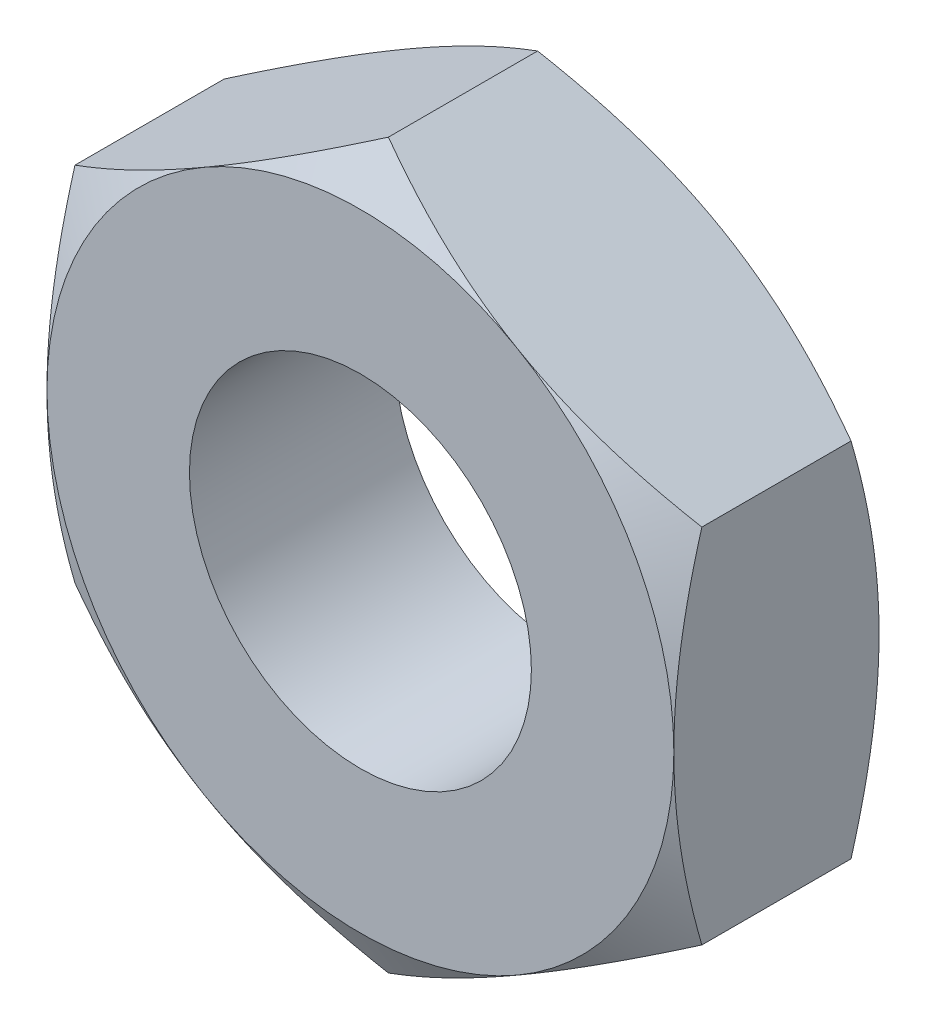
ISO-10303-21;
HEADER;
FILE_DESCRIPTION(('STEP AP214'),'2;1');
FILE_NAME('part.step','',(''),(''),'','','');
FILE_SCHEMA(('AUTOMOTIVE_DESIGN { 1 0 10303 214 1 1 1 1 }'));
ENDSEC;
DATA;
#1=APPLICATION_CONTEXT('core data for automotive mechanical design processes');
#2=APPLICATION_PROTOCOL_DEFINITION('international standard','automotive_design',2000,#1);
#3=PRODUCT_CONTEXT('',#1,'mechanical');
#4=PRODUCT('Part','Part','',(#3));
#5=PRODUCT_RELATED_PRODUCT_CATEGORY('part','',(#4));
#6=PRODUCT_DEFINITION_FORMATION('','',#4);
#7=PRODUCT_DEFINITION_CONTEXT('part definition',#1,'design');
#8=PRODUCT_DEFINITION('design','',#6,#7);
#9=PRODUCT_DEFINITION_SHAPE('','',#8);
#10=(LENGTH_UNIT() NAMED_UNIT(*) SI_UNIT(.MILLI.,.METRE.));
#11=(NAMED_UNIT(*) PLANE_ANGLE_UNIT() SI_UNIT($,.RADIAN.));
#12=(NAMED_UNIT(*) SI_UNIT($,.STERADIAN.) SOLID_ANGLE_UNIT());
#13=UNCERTAINTY_MEASURE_WITH_UNIT(LENGTH_MEASURE(1.E-05),#10,'distance_accuracy_value','');
#14=(GEOMETRIC_REPRESENTATION_CONTEXT(3) GLOBAL_UNCERTAINTY_ASSIGNED_CONTEXT((#13)) GLOBAL_UNIT_ASSIGNED_CONTEXT((#10,
#11,#12)) REPRESENTATION_CONTEXT('',''));
#15=CARTESIAN_POINT('',(0.,0.,0.));
#16=DIRECTION('',(0.,0.,1.));
#17=DIRECTION('',(1.,0.,0.));
#18=AXIS2_PLACEMENT_3D('',#15,#16,#17);
#19=CARTESIAN_POINT('',(0.,0.,-0.9));
#20=DIRECTION('',(0.,0.,1.));
#21=DIRECTION('',(1.,0.,0.));
#22=AXIS2_PLACEMENT_3D('',#19,#20,#21);
#23=PLANE('',#22);
#24=CARTESIAN_POINT('',(0.,0.,-0.9));
#25=DIRECTION('',(0.,0.,1.));
#26=DIRECTION('',(1.,0.,0.));
#27=AXIS2_PLACEMENT_3D('',#24,#25,#26);
#28=CIRCLE('',#27,1.5);
#29=CARTESIAN_POINT('',(1.5,0.,-0.9));
#30=VERTEX_POINT('',#29);
#31=EDGE_CURVE('E250',#30,#30,#28,.T.);
#32=ORIENTED_EDGE('',*,*,#31,.T.);
#33=EDGE_LOOP('',(#32));
#34=FACE_BOUND('',#33,.T.);
#35=CARTESIAN_POINT('',(0.,0.,-0.9));
#36=DIRECTION('',(0.,0.,1.));
#37=DIRECTION('',(1.,0.,0.));
#38=AXIS2_PLACEMENT_3D('',#35,#36,#37);
#39=CIRCLE('',#38,2.75);
#40=CARTESIAN_POINT('',(2.75,0.,-0.9));
#41=VERTEX_POINT('',#40);
#42=CARTESIAN_POINT('',(1.375,2.38156986040721,-0.9));
#43=VERTEX_POINT('',#42);
#44=EDGE_CURVE('E131',#41,#43,#39,.T.);
#45=ORIENTED_EDGE('',*,*,#44,.F.);
#46=CARTESIAN_POINT('',(0.,0.,-0.9));
#47=DIRECTION('',(0.,0.,1.));
#48=DIRECTION('',(1.,0.,0.));
#49=AXIS2_PLACEMENT_3D('',#46,#47,#48);
#50=CIRCLE('',#49,2.75);
#51=CARTESIAN_POINT('',(1.375,-2.38156986040721,-0.9));
#52=VERTEX_POINT('',#51);
#53=EDGE_CURVE('E12',#41,#52,#50,.F.);
#54=ORIENTED_EDGE('',*,*,#53,.T.);
#55=CARTESIAN_POINT('',(-1.375,-2.38156986040721,-0.9));
#56=VERTEX_POINT('',#55);
#57=EDGE_CURVE('E43',#52,#56,#50,.F.);
#58=ORIENTED_EDGE('',*,*,#57,.T.);
#59=CARTESIAN_POINT('',(-2.75,0.,-0.9));
#60=VERTEX_POINT('',#59);
#61=EDGE_CURVE('E309',#56,#60,#50,.F.);
#62=ORIENTED_EDGE('',*,*,#61,.T.);
#63=CARTESIAN_POINT('',(-1.375,2.38156986040721,-0.9));
#64=VERTEX_POINT('',#63);
#65=EDGE_CURVE('E143',#60,#64,#50,.F.);
#66=ORIENTED_EDGE('',*,*,#65,.T.);
#67=EDGE_CURVE('E44',#64,#43,#50,.F.);
#68=ORIENTED_EDGE('',*,*,#67,.T.);
#69=EDGE_LOOP('',(#45,#54,#58,#62,#66,#68));
#70=FACE_BOUND('',#69,.T.);
#71=ADVANCED_FACE('F34',(#34,#70),#23,.F.);
#72=CARTESIAN_POINT('',(0.,0.,0.9));
#73=DIRECTION('',(0.,0.,1.));
#74=DIRECTION('',(1.,0.,0.));
#75=AXIS2_PLACEMENT_3D('',#72,#73,#74);
#76=PLANE('',#75);
#77=CARTESIAN_POINT('',(0.,0.,0.9));
#78=DIRECTION('',(0.,0.,1.));
#79=DIRECTION('',(1.,0.,0.));
#80=AXIS2_PLACEMENT_3D('',#77,#78,#79);
#81=CIRCLE('',#80,1.5);
#82=CARTESIAN_POINT('',(1.5,0.,0.9));
#83=VERTEX_POINT('',#82);
#84=EDGE_CURVE('E246',#83,#83,#81,.T.);
#85=ORIENTED_EDGE('',*,*,#84,.F.);
#86=EDGE_LOOP('',(#85));
#87=FACE_BOUND('',#86,.T.);
#88=CARTESIAN_POINT('',(0.,0.,0.9));
#89=DIRECTION('',(0.,0.,1.));
#90=DIRECTION('',(1.,0.,0.));
#91=AXIS2_PLACEMENT_3D('',#88,#89,#90);
#92=CIRCLE('',#91,2.75);
#93=CARTESIAN_POINT('',(1.375,-2.38156986040721,0.9));
#94=VERTEX_POINT('',#93);
#95=CARTESIAN_POINT('',(2.75,0.,0.9));
#96=VERTEX_POINT('',#95);
#97=EDGE_CURVE('E291',#94,#96,#92,.T.);
#98=ORIENTED_EDGE('',*,*,#97,.T.);
#99=CARTESIAN_POINT('',(1.375,2.38156986040721,0.9));
#100=VERTEX_POINT('',#99);
#101=EDGE_CURVE('E280',#96,#100,#92,.T.);
#102=ORIENTED_EDGE('',*,*,#101,.T.);
#103=CARTESIAN_POINT('',(-1.375,2.38156986040721,0.9));
#104=VERTEX_POINT('',#103);
#105=EDGE_CURVE('E284',#100,#104,#92,.T.);
#106=ORIENTED_EDGE('',*,*,#105,.T.);
#107=CARTESIAN_POINT('',(-2.75,0.,0.9));
#108=VERTEX_POINT('',#107);
#109=EDGE_CURVE('E288',#104,#108,#92,.T.);
#110=ORIENTED_EDGE('',*,*,#109,.T.);
#111=CARTESIAN_POINT('',(-1.375,-2.38156986040721,0.9));
#112=VERTEX_POINT('',#111);
#113=EDGE_CURVE('E294',#108,#112,#92,.T.);
#114=ORIENTED_EDGE('',*,*,#113,.T.);
#115=EDGE_CURVE('E293',#112,#94,#92,.T.);
#116=ORIENTED_EDGE('',*,*,#115,.T.);
#117=EDGE_LOOP('',(#98,#102,#106,#110,#114,#116));
#118=FACE_BOUND('',#117,.T.);
#119=ADVANCED_FACE('F289',(#87,#118),#76,.T.);
#120=CARTESIAN_POINT('',(0.,3.17542648054294,0.9));
#121=DIRECTION('',(0.5,-0.866025403784438,0.));
#122=DIRECTION('',(0.866025403784438,0.5,0.));
#123=AXIS2_PLACEMENT_3D('',#120,#121,#122);
#124=PLANE('',#123);
#125=DIRECTION('',(0.,0.,-1.));
#126=VECTOR('',#125,1.);
#127=CARTESIAN_POINT('',(0.,3.17542648054294,0.9));
#128=LINE('',#127,#126);
#129=CARTESIAN_POINT('',(0.,3.17542648054294,0.654379906938138));
#130=VERTEX_POINT('',#129);
#131=CARTESIAN_POINT('',(0.,3.17542648054294,-0.654379906938138));
#132=VERTEX_POINT('',#131);
#133=EDGE_CURVE('E249',#130,#132,#128,.T.);
#134=ORIENTED_EDGE('',*,*,#133,.T.);
#135=CARTESIAN_POINT('',(0.000200000000002085,3.17554195059678,-0.65431323663524));
#136=CARTESIAN_POINT('',(-0.120649220659904,3.10576962051743,-0.694612337750737));
#137=CARTESIAN_POINT('',(-0.242541602622632,3.03539502097908,-0.731263097402338));
#138=CARTESIAN_POINT('',(-0.488437126727891,2.89342717394439,-0.795237817030199));
#139=CARTESIAN_POINT('',(-0.612444638573854,2.82183140359859,-0.822539144325502));
#140=CARTESIAN_POINT('',(-0.858922797975942,2.67952717191843,-0.865038254705883));
#141=CARTESIAN_POINT('',(-0.981355518587416,2.60884060771577,-0.880518881377543));
#142=CARTESIAN_POINT('',(-1.22679714236891,2.46713482015519,-0.89900060263006));
#143=CARTESIAN_POINT('',(-1.34980515323291,2.39611611197038,-0.902017000537401));
#144=CARTESIAN_POINT('',(-1.57965878661079,2.26341005486544,-0.895746854571454));
#145=CARTESIAN_POINT('',(-1.68653879125402,2.20170285541369,-0.887999845723298));
#146=CARTESIAN_POINT('',(-1.89960246733475,2.07869048467395,-0.863444818935646));
#147=CARTESIAN_POINT('',(-2.00578540164889,2.01738573896433,-0.84662841034943));
#148=CARTESIAN_POINT('',(-2.21928848939318,1.89411967378235,-0.804588077654045));
#149=CARTESIAN_POINT('',(-2.32658161614285,1.83217395817123,-0.77918591931277));
#150=CARTESIAN_POINT('',(-2.53956747928405,1.70920651275308,-0.721532774160019));
#151=CARTESIAN_POINT('',(-2.64526294502665,1.64818320715446,-0.689295336701019));
#152=CARTESIAN_POINT('',(-2.7502,1.58759777021763,-0.654313236635241));
#153=B_SPLINE_CURVE_WITH_KNOTS('',3,(#135,#136,#137,#138,#139,#140,#141,#142,#143,#144,#145,
#146,#147,#148,#149,#150,#151,#152),.UNSPECIFIED.,.F.,.F.,(4,2,2,2,2,2,2,2,4),(0.,
0.435912828725889,0.872873557116333,1.29901931904672,1.72464171213574,2.09526089052938,
2.46622354066375,2.84541551798557,3.22386274754525),.UNSPECIFIED.);
#154=EDGE_CURVE('E57',#132,#64,#153,.T.);
#155=ORIENTED_EDGE('',*,*,#154,.T.);
#156=CARTESIAN_POINT('',(-2.75,1.58771324027147,-0.654379906938139));
#157=VERTEX_POINT('',#156);
#158=EDGE_CURVE('E176',#64,#157,#153,.T.);
#159=ORIENTED_EDGE('',*,*,#158,.T.);
#160=DIRECTION('',(0.,0.,-1.));
#161=VECTOR('',#160,1.);
#162=CARTESIAN_POINT('',(-2.75,1.58771324027147,0.9));
#163=LINE('',#162,#161);
#164=CARTESIAN_POINT('',(-2.75,1.58771324027147,0.654379906938139));
#165=VERTEX_POINT('',#164);
#166=EDGE_CURVE('E264',#165,#157,#163,.T.);
#167=ORIENTED_EDGE('',*,*,#166,.F.);
#168=CARTESIAN_POINT('',(0.000200000000002085,3.17554195059678,0.65431323663524));
#169=CARTESIAN_POINT('',(-0.120649220659904,3.10576962051743,0.694612337750737));
#170=CARTESIAN_POINT('',(-0.242541602622632,3.03539502097908,0.731263097402338));
#171=CARTESIAN_POINT('',(-0.488437126727891,2.89342717394439,0.795237817030199));
#172=CARTESIAN_POINT('',(-0.612444638573854,2.82183140359859,0.822539144325502));
#173=CARTESIAN_POINT('',(-0.858922797975942,2.67952717191843,0.865038254705883));
#174=CARTESIAN_POINT('',(-0.981355518587416,2.60884060771577,0.880518881377543));
#175=CARTESIAN_POINT('',(-1.22679714236891,2.46713482015519,0.89900060263006));
#176=CARTESIAN_POINT('',(-1.34980515323291,2.39611611197038,0.902017000537401));
#177=CARTESIAN_POINT('',(-1.57965878661079,2.26341005486544,0.895746854571454));
#178=CARTESIAN_POINT('',(-1.68653879125402,2.20170285541369,0.887999845723298));
#179=CARTESIAN_POINT('',(-1.89960246733475,2.07869048467395,0.863444818935646));
#180=CARTESIAN_POINT('',(-2.00578540164889,2.01738573896433,0.84662841034943));
#181=CARTESIAN_POINT('',(-2.21928848939318,1.89411967378235,0.804588077654045));
#182=CARTESIAN_POINT('',(-2.32658161614285,1.83217395817123,0.77918591931277));
#183=CARTESIAN_POINT('',(-2.53956747928405,1.70920651275308,0.721532774160019));
#184=CARTESIAN_POINT('',(-2.64526294502665,1.64818320715446,0.689295336701019));
#185=CARTESIAN_POINT('',(-2.7502,1.58759777021763,0.654313236635241));
#186=B_SPLINE_CURVE_WITH_KNOTS('',3,(#168,#169,#170,#171,#172,#173,#174,#175,#176,#177,#178,
#179,#180,#181,#182,#183,#184,#185),.UNSPECIFIED.,.F.,.F.,(4,2,2,2,2,2,2,2,4),(0.,
0.435912828725889,0.872873557116333,1.29901931904672,1.72464171213574,2.09526089052938,
2.46622354066375,2.84541551798557,3.22386274754525),.UNSPECIFIED.);
#187=EDGE_CURVE('E239',#104,#165,#186,.T.);
#188=ORIENTED_EDGE('',*,*,#187,.F.);
#189=EDGE_CURVE('E245',#130,#104,#186,.T.);
#190=ORIENTED_EDGE('',*,*,#189,.F.);
#191=EDGE_LOOP('',(#134,#155,#159,#167,#188,#190));
#192=FACE_BOUND('',#191,.T.);
#193=ADVANCED_FACE('F36',(#192),#124,.F.);
#194=CARTESIAN_POINT('',(-2.75,1.58771324027147,0.9));
#195=DIRECTION('',(1.,0.,0.));
#196=DIRECTION('',(0.,0.,-1.));
#197=AXIS2_PLACEMENT_3D('',#194,#195,#196);
#198=PLANE('',#197);
#199=ORIENTED_EDGE('',*,*,#166,.T.);
#200=CARTESIAN_POINT('',(-2.75,5.23802739373754,0.927909249482761));
#201=CARTESIAN_POINT('',(-2.75,5.11527660498667,0.865169812411079));
#202=CARTESIAN_POINT('',(-2.75,4.99233811646048,0.802794260770052));
#203=CARTESIAN_POINT('',(-2.75,4.74600105011693,0.678952265513085));
#204=CARTESIAN_POINT('',(-2.75,4.62260246244002,0.617485841520821));
#205=CARTESIAN_POINT('',(-2.75,4.37505278117978,0.495541228246617));
#206=CARTESIAN_POINT('',(-2.75,4.25090075754906,0.435064923498204));
#207=CARTESIAN_POINT('',(-2.75,4.0019468382564,0.315458107881784));
#208=CARTESIAN_POINT('',(-2.75,3.87714493311206,0.256327616718463));
#209=CARTESIAN_POINT('',(-2.75,3.62040634471376,0.136773340145644));
#210=CARTESIAN_POINT('',(-2.75,3.48842913594874,0.0764363244025313));
#211=CARTESIAN_POINT('',(-2.75,3.22343308759545,-0.0419029079759702));
#212=CARTESIAN_POINT('',(-2.75,3.09041427827247,-0.0999051921520545));
#213=CARTESIAN_POINT('',(-2.75,2.82319707299625,-0.212875429393032));
#214=CARTESIAN_POINT('',(-2.75,2.68899957050019,-0.267845483618397));
#215=CARTESIAN_POINT('',(-2.75,2.41903711335082,-0.373912852315771));
#216=CARTESIAN_POINT('',(-2.75,2.2832717826642,-0.425009214504055));
#217=CARTESIAN_POINT('',(-2.75,1.98527927055217,-0.53087569525146));
#218=CARTESIAN_POINT('',(-2.75,1.82269199772477,-0.584648781126772));
#219=CARTESIAN_POINT('',(-2.75,1.49465793144698,-0.68246224458692));
#220=CARTESIAN_POINT('',(-2.75,1.32921270328706,-0.726507778402094));
#221=CARTESIAN_POINT('',(-2.75,0.998366624796109,-0.800846143831876));
#222=CARTESIAN_POINT('',(-2.75,0.833021970519671,-0.83137910910307));
#223=CARTESIAN_POINT('',(-2.75,0.583439014398776,-0.865334447800033));
#224=CARTESIAN_POINT('',(-2.75,0.499990853250087,-0.874678585038155));
#225=CARTESIAN_POINT('',(-2.75,0.332733015006017,-0.889132048946531));
#226=CARTESIAN_POINT('',(-2.75,0.248923392186114,-0.894241990577826));
#227=CARTESIAN_POINT('',(-2.75,0.0801799059774707,-0.900078391657486));
#228=CARTESIAN_POINT('',(-2.75,-0.00475574815370333,-0.90075346368716));
#229=CARTESIAN_POINT('',(-2.75,-0.174540835823682,-0.897559690526273));
#230=CARTESIAN_POINT('',(-2.75,-0.259390269053388,-0.893690829102988));
#231=CARTESIAN_POINT('',(-2.75,-0.428793026702043,-0.881548352573919));
#232=CARTESIAN_POINT('',(-2.75,-0.513346267750285,-0.873273584130448));
#233=CARTESIAN_POINT('',(-2.75,-0.681952305465295,-0.8526022261072));
#234=CARTESIAN_POINT('',(-2.75,-0.766005021289468,-0.840204988130795));
#235=CARTESIAN_POINT('',(-2.75,-1.02042594566478,-0.796835590917647));
#236=CARTESIAN_POINT('',(-2.75,-1.18979615465337,-0.759942542992945));
#237=CARTESIAN_POINT('',(-2.75,-1.5253995188284,-0.674190035622045));
#238=CARTESIAN_POINT('',(-2.75,-1.69163196675676,-0.62532791220697));
#239=CARTESIAN_POINT('',(-2.75,-2.0072297664761,-0.523375028259132));
#240=CARTESIAN_POINT('',(-2.75,-2.15682865798494,-0.470995777097286));
#241=CARTESIAN_POINT('',(-2.75,-2.45400964917883,-0.360767674544872));
#242=CARTESIAN_POINT('',(-2.75,-2.60159135262388,-0.302917765724954));
#243=CARTESIAN_POINT('',(-2.75,-2.89520473946976,-0.183085318705615));
#244=CARTESIAN_POINT('',(-2.75,-3.04123496351741,-0.121099230844212));
#245=CARTESIAN_POINT('',(-2.75,-3.33194409561411,0.00596805406822979));
#246=CARTESIAN_POINT('',(-2.75,-3.47662293880802,0.0710493987622811));
#247=CARTESIAN_POINT('',(-2.75,-3.75725588244321,0.200077928033693));
#248=CARTESIAN_POINT('',(-2.75,-3.89326643489279,0.263902796584246));
#249=CARTESIAN_POINT('',(-2.75,-4.16448737616721,0.393236641396951));
#250=CARTESIAN_POINT('',(-2.75,-4.29969774277466,0.458745664152753));
#251=CARTESIAN_POINT('',(-2.75,-4.56907603052969,0.590918401623318));
#252=CARTESIAN_POINT('',(-2.75,-4.70324582021608,0.65757831670672));
#253=CARTESIAN_POINT('',(-2.75,-4.97102629088773,0.791986535218604));
#254=CARTESIAN_POINT('',(-2.75,-5.10463701510275,0.859734752457689));
#255=CARTESIAN_POINT('',(-2.75,-5.23802739373754,0.927909249482763));
#256=B_SPLINE_CURVE_WITH_KNOTS('',3,(#200,#201,#202,#203,#204,#205,#206,#207,#208,#209,#210,
#211,#212,#213,#214,#215,#216,#217,#218,#219,#220,#221,#222,#223,#224,#225,#226,#227,#228,#229,
#230,#231,#232,#233,#234,#235,#236,#237,#238,#239,#240,#241,#242,#243,#244,#245,#246,#247,#248,
#249,#250,#251,#252,#253,#254,#255),.UNSPECIFIED.,.F.,.F.,(4,2,2,2,2,2,2,2,2,2,2,2,2,2,2,2,2,2,
2,2,2,2,2,2,2,2,2,4),(0.,0.413566579505386,0.827142072926082,1.24142992531015,1.65572383957957,
2.09105285248206,2.52636926282814,2.96138013356667,3.39649760014094,3.91001852505996,
4.42326659394234,4.92698640558132,5.17880354368182,5.43058410225224,5.68527700616001,
5.93997081993408,6.19473133790623,6.44953194448354,6.96890624541788,7.48839624920165,
7.96376913503023,8.43923409474552,8.91511248032541,9.39101358800162,9.84172390977599,
10.2924466874872,10.7418917934444,11.1913014788427),.UNSPECIFIED.);
#257=EDGE_CURVE('E297',#157,#60,#256,.T.);
#258=ORIENTED_EDGE('',*,*,#257,.T.);
#259=CARTESIAN_POINT('',(-2.75,-1.58771324027147,-0.654379906938139));
#260=VERTEX_POINT('',#259);
#261=EDGE_CURVE('E202',#60,#260,#256,.T.);
#262=ORIENTED_EDGE('',*,*,#261,.T.);
#263=DIRECTION('',(0.,0.,-1.));
#264=VECTOR('',#263,1.);
#265=CARTESIAN_POINT('',(-2.75,-1.58771324027147,0.9));
#266=LINE('',#265,#264);
#267=CARTESIAN_POINT('',(-2.75,-1.58771324027147,0.654379906938139));
#268=VERTEX_POINT('',#267);
#269=EDGE_CURVE('E261',#268,#260,#266,.T.);
#270=ORIENTED_EDGE('',*,*,#269,.F.);
#271=CARTESIAN_POINT('',(-2.75,5.23802739373754,-0.927909249482761));
#272=CARTESIAN_POINT('',(-2.75,5.11527660498667,-0.865169812411079));
#273=CARTESIAN_POINT('',(-2.75,4.99233811646048,-0.802794260770052));
#274=CARTESIAN_POINT('',(-2.75,4.74600105011693,-0.678952265513085));
#275=CARTESIAN_POINT('',(-2.75,4.62260246244002,-0.617485841520821));
#276=CARTESIAN_POINT('',(-2.75,4.37505278117978,-0.495541228246617));
#277=CARTESIAN_POINT('',(-2.75,4.25090075754906,-0.435064923498204));
#278=CARTESIAN_POINT('',(-2.75,4.0019468382564,-0.315458107881784));
#279=CARTESIAN_POINT('',(-2.75,3.87714493311206,-0.256327616718463));
#280=CARTESIAN_POINT('',(-2.75,3.62040634471376,-0.136773340145644));
#281=CARTESIAN_POINT('',(-2.75,3.48842913594874,-0.0764363244025314));
#282=CARTESIAN_POINT('',(-2.75,3.22343308759545,0.0419029079759704));
#283=CARTESIAN_POINT('',(-2.75,3.09041427827247,0.0999051921520549));
#284=CARTESIAN_POINT('',(-2.75,2.82319707299625,0.212875429393033));
#285=CARTESIAN_POINT('',(-2.75,2.68899957050019,0.267845483618397));
#286=CARTESIAN_POINT('',(-2.75,2.41903711335082,0.373912852315771));
#287=CARTESIAN_POINT('',(-2.75,2.2832717826642,0.425009214504055));
#288=CARTESIAN_POINT('',(-2.75,1.98527927055217,0.53087569525146));
#289=CARTESIAN_POINT('',(-2.75,1.82269199772477,0.584648781126772));
#290=CARTESIAN_POINT('',(-2.75,1.49465793144698,0.68246224458692));
#291=CARTESIAN_POINT('',(-2.75,1.32921270328706,0.726507778402094));
#292=CARTESIAN_POINT('',(-2.75,0.998366624796109,0.800846143831876));
#293=CARTESIAN_POINT('',(-2.75,0.833021970519671,0.83137910910307));
#294=CARTESIAN_POINT('',(-2.75,0.583439014398776,0.865334447800033));
#295=CARTESIAN_POINT('',(-2.75,0.499990853250087,0.874678585038155));
#296=CARTESIAN_POINT('',(-2.75,0.332733015006017,0.889132048946531));
#297=CARTESIAN_POINT('',(-2.75,0.248923392186114,0.894241990577826));
#298=CARTESIAN_POINT('',(-2.75,0.0801799059774707,0.900078391657486));
#299=CARTESIAN_POINT('',(-2.75,-0.00475574815370319,0.90075346368716));
#300=CARTESIAN_POINT('',(-2.75,-0.174540835823682,0.897559690526273));
#301=CARTESIAN_POINT('',(-2.75,-0.259390269053388,0.893690829102988));
#302=CARTESIAN_POINT('',(-2.75,-0.428793026702043,0.881548352573919));
#303=CARTESIAN_POINT('',(-2.75,-0.513346267750285,0.873273584130448));
#304=CARTESIAN_POINT('',(-2.75,-0.681952305465295,0.8526022261072));
#305=CARTESIAN_POINT('',(-2.75,-0.766005021289468,0.840204988130795));
#306=CARTESIAN_POINT('',(-2.75,-1.02042594566478,0.796835590917647));
#307=CARTESIAN_POINT('',(-2.75,-1.18979615465337,0.759942542992946));
#308=CARTESIAN_POINT('',(-2.75,-1.5253995188284,0.674190035622045));
#309=CARTESIAN_POINT('',(-2.75,-1.69163196675676,0.62532791220697));
#310=CARTESIAN_POINT('',(-2.75,-2.0072297664761,0.523375028259132));
#311=CARTESIAN_POINT('',(-2.75,-2.15682865798494,0.470995777097285));
#312=CARTESIAN_POINT('',(-2.75,-2.45400964917883,0.360767674544872));
#313=CARTESIAN_POINT('',(-2.75,-2.60159135262389,0.302917765724954));
#314=CARTESIAN_POINT('',(-2.75,-2.89520473946976,0.183085318705615));
#315=CARTESIAN_POINT('',(-2.75,-3.04123496351741,0.121099230844211));
#316=CARTESIAN_POINT('',(-2.75,-3.33194409561411,-0.00596805406823083));
#317=CARTESIAN_POINT('',(-2.75,-3.47662293880802,-0.0710493987622817));
#318=CARTESIAN_POINT('',(-2.75,-3.75725588244321,-0.200077928033693));
#319=CARTESIAN_POINT('',(-2.75,-3.89326643489279,-0.263902796584245));
#320=CARTESIAN_POINT('',(-2.75,-4.16448737616721,-0.39323664139695));
#321=CARTESIAN_POINT('',(-2.75,-4.29969774277466,-0.458745664152753));
#322=CARTESIAN_POINT('',(-2.75,-4.56907603052969,-0.590918401623319));
#323=CARTESIAN_POINT('',(-2.75,-4.70324582021608,-0.65757831670672));
#324=CARTESIAN_POINT('',(-2.75,-4.97102629088773,-0.791986535218604));
#325=CARTESIAN_POINT('',(-2.75,-5.10463701510275,-0.859734752457689));
#326=CARTESIAN_POINT('',(-2.75,-5.23802739373754,-0.927909249482763));
#327=B_SPLINE_CURVE_WITH_KNOTS('',3,(#271,#272,#273,#274,#275,#276,#277,#278,#279,#280,#281,
#282,#283,#284,#285,#286,#287,#288,#289,#290,#291,#292,#293,#294,#295,#296,#297,#298,#299,#300,
#301,#302,#303,#304,#305,#306,#307,#308,#309,#310,#311,#312,#313,#314,#315,#316,#317,#318,#319,
#320,#321,#322,#323,#324,#325,#326),.UNSPECIFIED.,.F.,.F.,(4,2,2,2,2,2,2,2,2,2,2,2,2,2,2,2,2,2,
2,2,2,2,2,2,2,2,2,4),(0.,0.413566579505386,0.827142072926082,1.24142992531015,1.65572383957957,
2.09105285248206,2.52636926282815,2.96138013356667,3.39649760014094,3.91001852505996,
4.42326659394234,4.92698640558132,5.17880354368182,5.43058410225224,5.68527700616001,
5.93997081993408,6.19473133790623,6.44953194448354,6.96890624541788,7.48839624920164,
7.96376913503023,8.43923409474553,8.91511248032541,9.39101358800162,9.84172390977598,
10.2924466874872,10.7418917934444,11.1913014788427),.UNSPECIFIED.);
#328=EDGE_CURVE('E232',#108,#268,#327,.T.);
#329=ORIENTED_EDGE('',*,*,#328,.F.);
#330=EDGE_CURVE('E238',#165,#108,#327,.T.);
#331=ORIENTED_EDGE('',*,*,#330,.F.);
#332=EDGE_LOOP('',(#199,#258,#262,#270,#329,#331));
#333=FACE_BOUND('',#332,.T.);
#334=ADVANCED_FACE('F211',(#333),#198,.F.);
#335=CARTESIAN_POINT('',(-2.75,-1.58771324027147,0.9));
#336=DIRECTION('',(0.5,0.866025403784439,0.));
#337=DIRECTION('',(-0.866025403784439,0.5,0.));
#338=AXIS2_PLACEMENT_3D('',#335,#336,#337);
#339=PLANE('',#338);
#340=ORIENTED_EDGE('',*,*,#269,.T.);
#341=CARTESIAN_POINT('',(-2.7502,-1.58759777021763,-0.654313236635241));
#342=CARTESIAN_POINT('',(-2.6293507793401,-1.65737010029699,-0.694612337750738));
#343=CARTESIAN_POINT('',(-2.50745839737737,-1.72774469983533,-0.731263097402339));
#344=CARTESIAN_POINT('',(-2.26156287327211,-1.86971254687003,-0.7952378170302));
#345=CARTESIAN_POINT('',(-2.13755536142614,-1.94130831721583,-0.822539144325503));
#346=CARTESIAN_POINT('',(-1.89107720202406,-2.08361254889599,-0.865038254705884));
#347=CARTESIAN_POINT('',(-1.76864448141258,-2.15429911309864,-0.880518881377543));
#348=CARTESIAN_POINT('',(-1.52320285763109,-2.29600490065923,-0.89900060263006));
#349=CARTESIAN_POINT('',(-1.40019484676709,-2.36702360884404,-0.9020170005374));
#350=CARTESIAN_POINT('',(-1.17034121338921,-2.49972966594897,-0.895746854571453));
#351=CARTESIAN_POINT('',(-1.06346120874598,-2.56143686540073,-0.887999845723298));
#352=CARTESIAN_POINT('',(-0.850397532665251,-2.68444923614047,-0.863444818935646));
#353=CARTESIAN_POINT('',(-0.744214598351111,-2.74575398185008,-0.84662841034943));
#354=CARTESIAN_POINT('',(-0.530711510606817,-2.86902004703206,-0.804588077654044));
#355=CARTESIAN_POINT('',(-0.423418383857145,-2.93096576264318,-0.77918591931277));
#356=CARTESIAN_POINT('',(-0.210432520715949,-3.05393320806134,-0.721532774160019));
#357=CARTESIAN_POINT('',(-0.104737054973348,-3.11495651365995,-0.689295336701018));
#358=CARTESIAN_POINT('',(0.00019999999999947,-3.17554195059678,-0.65431323663524));
#359=B_SPLINE_CURVE_WITH_KNOTS('',3,(#341,#342,#343,#344,#345,#346,#347,#348,#349,#350,#351,
#352,#353,#354,#355,#356,#357,#358),.UNSPECIFIED.,.F.,.F.,(4,2,2,2,2,2,2,2,4),(0.,
0.435912828725889,0.872873557116333,1.29901931904672,1.72464171213574,2.09526089052938,
2.46622354066374,2.84541551798557,3.22386274754524),.UNSPECIFIED.);
#360=EDGE_CURVE('E200',#260,#56,#359,.T.);
#361=ORIENTED_EDGE('',*,*,#360,.T.);
#362=CARTESIAN_POINT('',(0.,-3.17542648054294,-0.654379906938139));
#363=VERTEX_POINT('',#362);
#364=EDGE_CURVE('E193',#56,#363,#359,.T.);
#365=ORIENTED_EDGE('',*,*,#364,.T.);
#366=DIRECTION('',(0.,0.,-1.));
#367=VECTOR('',#366,1.);
#368=CARTESIAN_POINT('',(0.,-3.17542648054294,0.9));
#369=LINE('',#368,#367);
#370=CARTESIAN_POINT('',(0.,-3.17542648054294,0.654379906938139));
#371=VERTEX_POINT('',#370);
#372=EDGE_CURVE('E258',#371,#363,#369,.T.);
#373=ORIENTED_EDGE('',*,*,#372,.F.);
#374=CARTESIAN_POINT('',(-2.7502,-1.58759777021763,0.654313236635241));
#375=CARTESIAN_POINT('',(-2.6293507793401,-1.65737010029699,0.694612337750738));
#376=CARTESIAN_POINT('',(-2.50745839737737,-1.72774469983533,0.731263097402339));
#377=CARTESIAN_POINT('',(-2.26156287327211,-1.86971254687003,0.7952378170302));
#378=CARTESIAN_POINT('',(-2.13755536142614,-1.94130831721583,0.822539144325503));
#379=CARTESIAN_POINT('',(-1.89107720202406,-2.08361254889599,0.865038254705884));
#380=CARTESIAN_POINT('',(-1.76864448141258,-2.15429911309864,0.880518881377543));
#381=CARTESIAN_POINT('',(-1.52320285763109,-2.29600490065923,0.89900060263006));
#382=CARTESIAN_POINT('',(-1.40019484676709,-2.36702360884404,0.9020170005374));
#383=CARTESIAN_POINT('',(-1.17034121338921,-2.49972966594897,0.895746854571453));
#384=CARTESIAN_POINT('',(-1.06346120874598,-2.56143686540073,0.887999845723298));
#385=CARTESIAN_POINT('',(-0.850397532665251,-2.68444923614047,0.863444818935646));
#386=CARTESIAN_POINT('',(-0.744214598351111,-2.74575398185008,0.84662841034943));
#387=CARTESIAN_POINT('',(-0.530711510606817,-2.86902004703206,0.804588077654044));
#388=CARTESIAN_POINT('',(-0.423418383857145,-2.93096576264318,0.77918591931277));
#389=CARTESIAN_POINT('',(-0.210432520715949,-3.05393320806134,0.721532774160019));
#390=CARTESIAN_POINT('',(-0.104737054973348,-3.11495651365995,0.689295336701018));
#391=CARTESIAN_POINT('',(0.00019999999999947,-3.17554195059678,0.65431323663524));
#392=B_SPLINE_CURVE_WITH_KNOTS('',3,(#374,#375,#376,#377,#378,#379,#380,#381,#382,#383,#384,
#385,#386,#387,#388,#389,#390,#391),.UNSPECIFIED.,.F.,.F.,(4,2,2,2,2,2,2,2,4),(0.,
0.435912828725889,0.872873557116333,1.29901931904672,1.72464171213574,2.09526089052938,
2.46622354066374,2.84541551798557,3.22386274754524),.UNSPECIFIED.);
#393=EDGE_CURVE('E217',#112,#371,#392,.T.);
#394=ORIENTED_EDGE('',*,*,#393,.F.);
#395=EDGE_CURVE('E224',#268,#112,#392,.T.);
#396=ORIENTED_EDGE('',*,*,#395,.F.);
#397=EDGE_LOOP('',(#340,#361,#365,#373,#394,#396));
#398=FACE_BOUND('',#397,.T.);
#399=ADVANCED_FACE('F207',(#398),#339,.F.);
#400=CARTESIAN_POINT('',(0.,-3.17542648054294,0.9));
#401=DIRECTION('',(-0.500000000000001,0.866025403784438,0.));
#402=DIRECTION('',(-0.866025403784438,-0.500000000000001,0.));
#403=AXIS2_PLACEMENT_3D('',#400,#401,#402);
#404=PLANE('',#403);
#405=ORIENTED_EDGE('',*,*,#372,.T.);
#406=CARTESIAN_POINT('',(-0.000200000000000907,-3.17554195059678,-0.654313236635241));
#407=CARTESIAN_POINT('',(0.120649220659905,-3.10576962051743,-0.694612337750738));
#408=CARTESIAN_POINT('',(0.242541602622633,-3.03539502097908,-0.731263097402339));
#409=CARTESIAN_POINT('',(0.488437126727892,-2.89342717394439,-0.7952378170302));
#410=CARTESIAN_POINT('',(0.612444638573855,-2.82183140359858,-0.822539144325503));
#411=CARTESIAN_POINT('',(0.858922797975943,-2.67952717191842,-0.865038254705884));
#412=CARTESIAN_POINT('',(0.981355518587417,-2.60884060771577,-0.880518881377543));
#413=CARTESIAN_POINT('',(1.22679714236891,-2.46713482015518,-0.899000602630061));
#414=CARTESIAN_POINT('',(1.34980515323291,-2.39611611197038,-0.902017000537402));
#415=CARTESIAN_POINT('',(1.57965878661079,-2.26341005486544,-0.895746854571455));
#416=CARTESIAN_POINT('',(1.68653879125402,-2.20170285541369,-0.887999845723299));
#417=CARTESIAN_POINT('',(1.89960246733475,-2.07869048467395,-0.863444818935647));
#418=CARTESIAN_POINT('',(2.00578540164889,-2.01738573896433,-0.846628410349432));
#419=CARTESIAN_POINT('',(2.21928848939318,-1.89411967378235,-0.804588077654046));
#420=CARTESIAN_POINT('',(2.32658161614285,-1.83217395817123,-0.779185919312772));
#421=CARTESIAN_POINT('',(2.53956747928405,-1.70920651275308,-0.721532774160021));
#422=CARTESIAN_POINT('',(2.64526294502665,-1.64818320715446,-0.689295336701021));
#423=CARTESIAN_POINT('',(2.7502,-1.58759777021763,-0.654313236635243));
#424=B_SPLINE_CURVE_WITH_KNOTS('',3,(#406,#407,#408,#409,#410,#411,#412,#413,#414,#415,#416,
#417,#418,#419,#420,#421,#422,#423),.UNSPECIFIED.,.F.,.F.,(4,2,2,2,2,2,2,2,4),(0.,
0.435912828725889,0.872873557116333,1.29901931904672,1.72464171213574,2.09526089052937,
2.46622354066374,2.84541551798557,3.22386274754524),.UNSPECIFIED.);
#425=EDGE_CURVE('E201',#363,#52,#424,.T.);
#426=ORIENTED_EDGE('',*,*,#425,.T.);
#427=CARTESIAN_POINT('',(2.75,-1.58771324027147,-0.654379906938141));
#428=VERTEX_POINT('',#427);
#429=EDGE_CURVE('E186',#52,#428,#424,.T.);
#430=ORIENTED_EDGE('',*,*,#429,.T.);
#431=DIRECTION('',(0.,0.,-1.));
#432=VECTOR('',#431,1.);
#433=CARTESIAN_POINT('',(2.75,-1.58771324027147,0.9));
#434=LINE('',#433,#432);
#435=CARTESIAN_POINT('',(2.75,-1.58771324027147,0.654379906938141));
#436=VERTEX_POINT('',#435);
#437=EDGE_CURVE('E255',#436,#428,#434,.T.);
#438=ORIENTED_EDGE('',*,*,#437,.F.);
#439=CARTESIAN_POINT('',(-0.000200000000000907,-3.17554195059678,0.654313236635241));
#440=CARTESIAN_POINT('',(0.120649220659905,-3.10576962051743,0.694612337750738));
#441=CARTESIAN_POINT('',(0.242541602622633,-3.03539502097908,0.731263097402339));
#442=CARTESIAN_POINT('',(0.488437126727892,-2.89342717394439,0.7952378170302));
#443=CARTESIAN_POINT('',(0.612444638573855,-2.82183140359858,0.822539144325503));
#444=CARTESIAN_POINT('',(0.858922797975943,-2.67952717191842,0.865038254705884));
#445=CARTESIAN_POINT('',(0.981355518587417,-2.60884060771577,0.880518881377543));
#446=CARTESIAN_POINT('',(1.22679714236891,-2.46713482015518,0.899000602630061));
#447=CARTESIAN_POINT('',(1.34980515323291,-2.39611611197038,0.902017000537402));
#448=CARTESIAN_POINT('',(1.57965878661079,-2.26341005486544,0.895746854571455));
#449=CARTESIAN_POINT('',(1.68653879125402,-2.20170285541369,0.887999845723299));
#450=CARTESIAN_POINT('',(1.89960246733475,-2.07869048467395,0.863444818935647));
#451=CARTESIAN_POINT('',(2.00578540164889,-2.01738573896433,0.846628410349432));
#452=CARTESIAN_POINT('',(2.21928848939318,-1.89411967378235,0.804588077654046));
#453=CARTESIAN_POINT('',(2.32658161614285,-1.83217395817123,0.779185919312772));
#454=CARTESIAN_POINT('',(2.53956747928405,-1.70920651275308,0.721532774160021));
#455=CARTESIAN_POINT('',(2.64526294502665,-1.64818320715446,0.689295336701021));
#456=CARTESIAN_POINT('',(2.7502,-1.58759777021763,0.654313236635243));
#457=B_SPLINE_CURVE_WITH_KNOTS('',3,(#439,#440,#441,#442,#443,#444,#445,#446,#447,#448,#449,
#450,#451,#452,#453,#454,#455,#456),.UNSPECIFIED.,.F.,.F.,(4,2,2,2,2,2,2,2,4),(0.,
0.435912828725889,0.872873557116333,1.29901931904672,1.72464171213574,2.09526089052937,
2.46622354066374,2.84541551798557,3.22386274754524),.UNSPECIFIED.);
#458=EDGE_CURVE('E226',#94,#436,#457,.T.);
#459=ORIENTED_EDGE('',*,*,#458,.F.);
#460=EDGE_CURVE('E225',#371,#94,#457,.T.);
#461=ORIENTED_EDGE('',*,*,#460,.F.);
#462=EDGE_LOOP('',(#405,#426,#430,#438,#459,#461));
#463=FACE_BOUND('',#462,.T.);
#464=ADVANCED_FACE('F210',(#463),#404,.F.);
#465=CARTESIAN_POINT('',(2.75,-1.58771324027147,0.9));
#466=DIRECTION('',(-1.,0.,0.));
#467=DIRECTION('',(0.,0.,1.));
#468=AXIS2_PLACEMENT_3D('',#465,#466,#467);
#469=PLANE('',#468);
#470=ORIENTED_EDGE('',*,*,#437,.T.);
#471=CARTESIAN_POINT('',(2.75,-5.23802739373755,0.927909249482763));
#472=CARTESIAN_POINT('',(2.75,-5.11527660498667,0.86516981241108));
#473=CARTESIAN_POINT('',(2.75,-4.99233811646049,0.802794260770053));
#474=CARTESIAN_POINT('',(2.75,-4.74600105011693,0.678952265513087));
#475=CARTESIAN_POINT('',(2.75,-4.62260246244002,0.617485841520822));
#476=CARTESIAN_POINT('',(2.75,-4.37505278117978,0.495541228246618));
#477=CARTESIAN_POINT('',(2.75,-4.25090075754906,0.435064923498205));
#478=CARTESIAN_POINT('',(2.75,-4.0019468382564,0.315458107881785));
#479=CARTESIAN_POINT('',(2.75,-3.87714493311207,0.256327616718464));
#480=CARTESIAN_POINT('',(2.75,-3.62040634471376,0.136773340145644));
#481=CARTESIAN_POINT('',(2.75,-3.48842913594874,0.0764363244025312));
#482=CARTESIAN_POINT('',(2.75,-3.22343308759545,-0.0419029079759704));
#483=CARTESIAN_POINT('',(2.75,-3.09041427827248,-0.0999051921520548));
#484=CARTESIAN_POINT('',(2.75,-2.82319707299625,-0.212875429393033));
#485=CARTESIAN_POINT('',(2.75,-2.68899957050019,-0.267845483618398));
#486=CARTESIAN_POINT('',(2.75,-2.41903711335082,-0.373912852315772));
#487=CARTESIAN_POINT('',(2.75,-2.2832717826642,-0.425009214504056));
#488=CARTESIAN_POINT('',(2.75,-1.98527927055217,-0.530875695251461));
#489=CARTESIAN_POINT('',(2.75,-1.82269199772477,-0.584648781126773));
#490=CARTESIAN_POINT('',(2.75,-1.49465793144698,-0.682462244586922));
#491=CARTESIAN_POINT('',(2.75,-1.32921270328707,-0.726507778402096));
#492=CARTESIAN_POINT('',(2.75,-0.998366624796114,-0.800846143831878));
#493=CARTESIAN_POINT('',(2.75,-0.833021970519676,-0.831379109103072));
#494=CARTESIAN_POINT('',(2.75,-0.583439014398781,-0.865334447800035));
#495=CARTESIAN_POINT('',(2.75,-0.499990853250093,-0.874678585038157));
#496=CARTESIAN_POINT('',(2.75,-0.332733015006023,-0.889132048946533));
#497=CARTESIAN_POINT('',(2.75,-0.24892339218612,-0.894241990577829));
#498=CARTESIAN_POINT('',(2.75,-0.0801799059774762,-0.900078391657489));
#499=CARTESIAN_POINT('',(2.75,0.00475574815369772,-0.900753463687164));
#500=CARTESIAN_POINT('',(2.75,0.174540835823676,-0.897559690526276));
#501=CARTESIAN_POINT('',(2.75,0.259390269053382,-0.893690829102991));
#502=CARTESIAN_POINT('',(2.75,0.428793026702037,-0.881548352573922));
#503=CARTESIAN_POINT('',(2.75,0.513346267750279,-0.873273584130452));
#504=CARTESIAN_POINT('',(2.75,0.681952305465289,-0.852602226107204));
#505=CARTESIAN_POINT('',(2.75,0.766005021289462,-0.840204988130799));
#506=CARTESIAN_POINT('',(2.75,1.02042594566478,-0.796835590917652));
#507=CARTESIAN_POINT('',(2.75,1.18979615465336,-0.75994254299295));
#508=CARTESIAN_POINT('',(2.75,1.52539951882839,-0.674190035622049));
#509=CARTESIAN_POINT('',(2.75,1.69163196675676,-0.625327912206975));
#510=CARTESIAN_POINT('',(2.75,2.00722976647609,-0.523375028259137));
#511=CARTESIAN_POINT('',(2.75,2.15682865798493,-0.47099577709729));
#512=CARTESIAN_POINT('',(2.75,2.45400964917882,-0.360767674544877));
#513=CARTESIAN_POINT('',(2.75,2.60159135262388,-0.302917765724958));
#514=CARTESIAN_POINT('',(2.75,2.89520473946976,-0.183085318705619));
#515=CARTESIAN_POINT('',(2.75,3.0412349635174,-0.121099230844215));
#516=CARTESIAN_POINT('',(2.75,3.33194409561411,0.00596805406822743));
#517=CARTESIAN_POINT('',(2.75,3.47662293880802,0.071049398762279));
#518=CARTESIAN_POINT('',(2.75,3.75725588244321,0.200077928033691));
#519=CARTESIAN_POINT('',(2.75,3.89326643489279,0.263902796584245));
#520=CARTESIAN_POINT('',(2.75,4.16448737616721,0.393236641396949));
#521=CARTESIAN_POINT('',(2.75,4.29969774277466,0.458745664152753));
#522=CARTESIAN_POINT('',(2.75,4.56907603052969,0.590918401623319));
#523=CARTESIAN_POINT('',(2.75,4.70324582021609,0.65757831670672));
#524=CARTESIAN_POINT('',(2.75,4.97102629088773,0.791986535218606));
#525=CARTESIAN_POINT('',(2.75,5.10463701510276,0.859734752457691));
#526=CARTESIAN_POINT('',(2.75,5.23802739373755,0.927909249482765));
#527=B_SPLINE_CURVE_WITH_KNOTS('',3,(#471,#472,#473,#474,#475,#476,#477,#478,#479,#480,#481,
#482,#483,#484,#485,#486,#487,#488,#489,#490,#491,#492,#493,#494,#495,#496,#497,#498,#499,#500,
#501,#502,#503,#504,#505,#506,#507,#508,#509,#510,#511,#512,#513,#514,#515,#516,#517,#518,#519,
#520,#521,#522,#523,#524,#525,#526),.UNSPECIFIED.,.F.,.F.,(4,2,2,2,2,2,2,2,2,2,2,2,2,2,2,2,2,2,
2,2,2,2,2,2,2,2,2,4),(0.,0.413566579505386,0.827142072926082,1.24142992531015,1.65572383957957,
2.09105285248206,2.52636926282815,2.96138013356667,3.39649760014095,3.91001852505997,
4.42326659394234,4.92698640558132,5.17880354368182,5.43058410225225,5.68527700616002,
5.93997081993408,6.19473133790623,6.44953194448354,6.96890624541788,7.48839624920165,
7.96376913503023,8.43923409474553,8.91511248032541,9.39101358800163,9.841723909776,
10.2924466874872,10.7418917934444,11.1913014788428),.UNSPECIFIED.);
#528=EDGE_CURVE('E150',#428,#41,#527,.T.);
#529=ORIENTED_EDGE('',*,*,#528,.T.);
#530=CARTESIAN_POINT('',(2.75,1.58771324027148,-0.65437990693814));
#531=VERTEX_POINT('',#530);
#532=EDGE_CURVE('E137',#41,#531,#527,.T.);
#533=ORIENTED_EDGE('',*,*,#532,.T.);
#534=DIRECTION('',(0.,0.,-1.));
#535=VECTOR('',#534,1.);
#536=CARTESIAN_POINT('',(2.75,1.58771324027148,0.9));
#537=LINE('',#536,#535);
#538=CARTESIAN_POINT('',(2.75,1.58771324027148,0.65437990693814));
#539=VERTEX_POINT('',#538);
#540=EDGE_CURVE('E149',#539,#531,#537,.T.);
#541=ORIENTED_EDGE('',*,*,#540,.F.);
#542=CARTESIAN_POINT('',(2.75,-5.23802739373755,-0.927909249482763));
#543=CARTESIAN_POINT('',(2.75,-5.11527660498667,-0.86516981241108));
#544=CARTESIAN_POINT('',(2.75,-4.99233811646049,-0.802794260770053));
#545=CARTESIAN_POINT('',(2.75,-4.74600105011693,-0.678952265513087));
#546=CARTESIAN_POINT('',(2.75,-4.62260246244002,-0.617485841520822));
#547=CARTESIAN_POINT('',(2.75,-4.37505278117978,-0.495541228246618));
#548=CARTESIAN_POINT('',(2.75,-4.25090075754906,-0.435064923498205));
#549=CARTESIAN_POINT('',(2.75,-4.0019468382564,-0.315458107881785));
#550=CARTESIAN_POINT('',(2.75,-3.87714493311207,-0.256327616718464));
#551=CARTESIAN_POINT('',(2.75,-3.62040634471376,-0.136773340145644));
#552=CARTESIAN_POINT('',(2.75,-3.48842913594874,-0.0764363244025312));
#553=CARTESIAN_POINT('',(2.75,-3.22343308759545,0.0419029079759704));
#554=CARTESIAN_POINT('',(2.75,-3.09041427827248,0.0999051921520548));
#555=CARTESIAN_POINT('',(2.75,-2.82319707299625,0.212875429393033));
#556=CARTESIAN_POINT('',(2.75,-2.68899957050019,0.267845483618398));
#557=CARTESIAN_POINT('',(2.75,-2.41903711335082,0.373912852315772));
#558=CARTESIAN_POINT('',(2.75,-2.2832717826642,0.425009214504056));
#559=CARTESIAN_POINT('',(2.75,-1.98527927055217,0.530875695251461));
#560=CARTESIAN_POINT('',(2.75,-1.82269199772477,0.584648781126773));
#561=CARTESIAN_POINT('',(2.75,-1.49465793144698,0.682462244586922));
#562=CARTESIAN_POINT('',(2.75,-1.32921270328707,0.726507778402096));
#563=CARTESIAN_POINT('',(2.75,-0.998366624796114,0.800846143831878));
#564=CARTESIAN_POINT('',(2.75,-0.833021970519676,0.831379109103072));
#565=CARTESIAN_POINT('',(2.75,-0.583439014398781,0.865334447800035));
#566=CARTESIAN_POINT('',(2.75,-0.499990853250093,0.874678585038157));
#567=CARTESIAN_POINT('',(2.75,-0.332733015006023,0.889132048946533));
#568=CARTESIAN_POINT('',(2.75,-0.24892339218612,0.894241990577829));
#569=CARTESIAN_POINT('',(2.75,-0.0801799059774762,0.900078391657489));
#570=CARTESIAN_POINT('',(2.75,0.00475574815369772,0.900753463687164));
#571=CARTESIAN_POINT('',(2.75,0.174540835823676,0.897559690526276));
#572=CARTESIAN_POINT('',(2.75,0.259390269053382,0.893690829102991));
#573=CARTESIAN_POINT('',(2.75,0.428793026702037,0.881548352573922));
#574=CARTESIAN_POINT('',(2.75,0.513346267750279,0.873273584130452));
#575=CARTESIAN_POINT('',(2.75,0.681952305465289,0.852602226107204));
#576=CARTESIAN_POINT('',(2.75,0.766005021289462,0.840204988130799));
#577=CARTESIAN_POINT('',(2.75,1.02042594566478,0.796835590917652));
#578=CARTESIAN_POINT('',(2.75,1.18979615465336,0.75994254299295));
#579=CARTESIAN_POINT('',(2.75,1.52539951882839,0.674190035622049));
#580=CARTESIAN_POINT('',(2.75,1.69163196675676,0.625327912206975));
#581=CARTESIAN_POINT('',(2.75,2.00722976647609,0.523375028259137));
#582=CARTESIAN_POINT('',(2.75,2.15682865798493,0.47099577709729));
#583=CARTESIAN_POINT('',(2.75,2.45400964917882,0.360767674544877));
#584=CARTESIAN_POINT('',(2.75,2.60159135262388,0.302917765724958));
#585=CARTESIAN_POINT('',(2.75,2.89520473946976,0.183085318705619));
#586=CARTESIAN_POINT('',(2.75,3.0412349635174,0.121099230844215));
#587=CARTESIAN_POINT('',(2.75,3.33194409561411,-0.00596805406822743));
#588=CARTESIAN_POINT('',(2.75,3.47662293880802,-0.071049398762279));
#589=CARTESIAN_POINT('',(2.75,3.75725588244321,-0.200077928033691));
#590=CARTESIAN_POINT('',(2.75,3.89326643489279,-0.263902796584245));
#591=CARTESIAN_POINT('',(2.75,4.16448737616721,-0.393236641396949));
#592=CARTESIAN_POINT('',(2.75,4.29969774277466,-0.458745664152753));
#593=CARTESIAN_POINT('',(2.75,4.56907603052969,-0.590918401623319));
#594=CARTESIAN_POINT('',(2.75,4.70324582021609,-0.65757831670672));
#595=CARTESIAN_POINT('',(2.75,4.97102629088773,-0.791986535218606));
#596=CARTESIAN_POINT('',(2.75,5.10463701510276,-0.859734752457691));
#597=CARTESIAN_POINT('',(2.75,5.23802739373755,-0.927909249482765));
#598=B_SPLINE_CURVE_WITH_KNOTS('',3,(#542,#543,#544,#545,#546,#547,#548,#549,#550,#551,#552,
#553,#554,#555,#556,#557,#558,#559,#560,#561,#562,#563,#564,#565,#566,#567,#568,#569,#570,#571,
#572,#573,#574,#575,#576,#577,#578,#579,#580,#581,#582,#583,#584,#585,#586,#587,#588,#589,#590,
#591,#592,#593,#594,#595,#596,#597),.UNSPECIFIED.,.F.,.F.,(4,2,2,2,2,2,2,2,2,2,2,2,2,2,2,2,2,2,
2,2,2,2,2,2,2,2,2,4),(0.,0.413566579505386,0.827142072926082,1.24142992531015,1.65572383957957,
2.09105285248206,2.52636926282815,2.96138013356667,3.39649760014095,3.91001852505997,
4.42326659394234,4.92698640558132,5.17880354368182,5.43058410225225,5.68527700616002,
5.93997081993408,6.19473133790623,6.44953194448354,6.96890624541788,7.48839624920165,
7.96376913503023,8.43923409474553,8.91511248032541,9.39101358800163,9.841723909776,
10.2924466874872,10.7418917934444,11.1913014788428),.UNSPECIFIED.);
#599=EDGE_CURVE('E282',#96,#539,#598,.T.);
#600=ORIENTED_EDGE('',*,*,#599,.F.);
#601=EDGE_CURVE('E292',#436,#96,#598,.T.);
#602=ORIENTED_EDGE('',*,*,#601,.F.);
#603=EDGE_LOOP('',(#470,#529,#533,#541,#600,#602));
#604=FACE_BOUND('',#603,.T.);
#605=ADVANCED_FACE('F319',(#604),#469,.F.);
#606=CARTESIAN_POINT('',(2.75,1.58771324027148,0.9));
#607=DIRECTION('',(-0.5,-0.866025403784438,0.));
#608=DIRECTION('',(0.866025403784438,-0.5,0.));
#609=AXIS2_PLACEMENT_3D('',#606,#607,#608);
#610=PLANE('',#609);
#611=ORIENTED_EDGE('',*,*,#540,.T.);
#612=CARTESIAN_POINT('',(2.7502,1.58759777021764,-0.654313236635242));
#613=CARTESIAN_POINT('',(2.62935077934009,1.65737010029699,-0.694612337750739));
#614=CARTESIAN_POINT('',(2.50745839737736,1.72774469983534,-0.73126309740234));
#615=CARTESIAN_POINT('',(2.2615628732721,1.86971254687003,-0.7952378170302));
#616=CARTESIAN_POINT('',(2.13755536142614,1.94130831721583,-0.822539144325504));
#617=CARTESIAN_POINT('',(1.89107720202405,2.08361254889599,-0.865038254705884));
#618=CARTESIAN_POINT('',(1.76864448141258,2.15429911309865,-0.880518881377542));
#619=CARTESIAN_POINT('',(1.52320285763108,2.29600490065923,-0.899000602630059));
#620=CARTESIAN_POINT('',(1.40019484676708,2.36702360884404,-0.9020170005374));
#621=CARTESIAN_POINT('',(1.1703412133892,2.49972966594898,-0.895746854571452));
#622=CARTESIAN_POINT('',(1.06346120874598,2.56143686540073,-0.887999845723296));
#623=CARTESIAN_POINT('',(0.850397532665248,2.68444923614047,-0.863444818935644));
#624=CARTESIAN_POINT('',(0.744214598351109,2.74575398185008,-0.846628410349428));
#625=CARTESIAN_POINT('',(0.530711510606816,2.86902004703207,-0.804588077654042));
#626=CARTESIAN_POINT('',(0.423418383857145,2.93096576264319,-0.779185919312768));
#627=CARTESIAN_POINT('',(0.21043252071595,3.05393320806134,-0.721532774160017));
#628=CARTESIAN_POINT('',(0.104737054973349,3.11495651365995,-0.689295336701017));
#629=CARTESIAN_POINT('',(-0.000199999999997838,3.17554195059678,-0.654313236635239));
#630=B_SPLINE_CURVE_WITH_KNOTS('',3,(#612,#613,#614,#615,#616,#617,#618,#619,#620,#621,#622,
#623,#624,#625,#626,#627,#628,#629),.UNSPECIFIED.,.F.,.F.,(4,2,2,2,2,2,2,2,4),(0.,
0.435912828725888,0.872873557116332,1.29901931904671,1.72464171213574,2.09526089052937,
2.46622354066374,2.84541551798557,3.22386274754524),.UNSPECIFIED.);
#631=EDGE_CURVE('E130',#531,#43,#630,.T.);
#632=ORIENTED_EDGE('',*,*,#631,.T.);
#633=EDGE_CURVE('E121',#43,#132,#630,.T.);
#634=ORIENTED_EDGE('',*,*,#633,.T.);
#635=ORIENTED_EDGE('',*,*,#133,.F.);
#636=CARTESIAN_POINT('',(2.7502,1.58759777021764,0.654313236635242));
#637=CARTESIAN_POINT('',(2.62935077934009,1.65737010029699,0.694612337750739));
#638=CARTESIAN_POINT('',(2.50745839737736,1.72774469983534,0.73126309740234));
#639=CARTESIAN_POINT('',(2.2615628732721,1.86971254687003,0.7952378170302));
#640=CARTESIAN_POINT('',(2.13755536142614,1.94130831721583,0.822539144325504));
#641=CARTESIAN_POINT('',(1.89107720202405,2.08361254889599,0.865038254705884));
#642=CARTESIAN_POINT('',(1.76864448141258,2.15429911309865,0.880518881377542));
#643=CARTESIAN_POINT('',(1.52320285763108,2.29600490065923,0.899000602630059));
#644=CARTESIAN_POINT('',(1.40019484676708,2.36702360884404,0.9020170005374));
#645=CARTESIAN_POINT('',(1.1703412133892,2.49972966594898,0.895746854571452));
#646=CARTESIAN_POINT('',(1.06346120874598,2.56143686540073,0.887999845723296));
#647=CARTESIAN_POINT('',(0.850397532665248,2.68444923614047,0.863444818935644));
#648=CARTESIAN_POINT('',(0.744214598351109,2.74575398185008,0.846628410349428));
#649=CARTESIAN_POINT('',(0.530711510606816,2.86902004703207,0.804588077654042));
#650=CARTESIAN_POINT('',(0.423418383857145,2.93096576264319,0.779185919312768));
#651=CARTESIAN_POINT('',(0.21043252071595,3.05393320806134,0.721532774160017));
#652=CARTESIAN_POINT('',(0.104737054973349,3.11495651365995,0.689295336701017));
#653=CARTESIAN_POINT('',(-0.000199999999997838,3.17554195059678,0.654313236635239));
#654=B_SPLINE_CURVE_WITH_KNOTS('',3,(#636,#637,#638,#639,#640,#641,#642,#643,#644,#645,#646,
#647,#648,#649,#650,#651,#652,#653),.UNSPECIFIED.,.F.,.F.,(4,2,2,2,2,2,2,2,4),(0.,
0.435912828725888,0.872873557116332,1.29901931904671,1.72464171213574,2.09526089052937,
2.46622354066374,2.84541551798557,3.22386274754524),.UNSPECIFIED.);
#655=EDGE_CURVE('E266',#100,#130,#654,.T.);
#656=ORIENTED_EDGE('',*,*,#655,.F.);
#657=EDGE_CURVE('E144',#539,#100,#654,.T.);
#658=ORIENTED_EDGE('',*,*,#657,.F.);
#659=EDGE_LOOP('',(#611,#632,#634,#635,#656,#658));
#660=FACE_BOUND('',#659,.T.);
#661=ADVANCED_FACE('F146',(#660),#610,.F.);
#662=CARTESIAN_POINT('',(0.,0.,0.9));
#663=DIRECTION('',(0.,0.,-1.));
#664=DIRECTION('',(-1.,0.,0.));
#665=AXIS2_PLACEMENT_3D('',#662,#663,#664);
#666=CYLINDRICAL_SURFACE('',#665,1.5);
#667=ORIENTED_EDGE('',*,*,#84,.T.);
#668=EDGE_LOOP('',(#667));
#669=FACE_BOUND('',#668,.T.);
#670=ORIENTED_EDGE('',*,*,#31,.F.);
#671=EDGE_LOOP('',(#670));
#672=FACE_BOUND('',#671,.T.);
#673=ADVANCED_FACE('F335',(#669,#672),#666,.F.);
#674=CARTESIAN_POINT('',(0.,0.,0.9));
#675=DIRECTION('',(0.,0.,-1.));
#676=DIRECTION('',(1.,0.,0.));
#677=AXIS2_PLACEMENT_3D('',#674,#675,#676);
#678=CONICAL_SURFACE('',#677,2.75,1.0471975511966);
#679=ORIENTED_EDGE('',*,*,#189,.T.);
#680=ORIENTED_EDGE('',*,*,#105,.F.);
#681=ORIENTED_EDGE('',*,*,#655,.T.);
#682=EDGE_LOOP('',(#679,#680,#681));
#683=FACE_BOUND('',#682,.T.);
#684=ADVANCED_FACE('F170',(#683),#678,.T.);
#685=ORIENTED_EDGE('',*,*,#599,.T.);
#686=ORIENTED_EDGE('',*,*,#657,.T.);
#687=ORIENTED_EDGE('',*,*,#101,.F.);
#688=EDGE_LOOP('',(#685,#686,#687));
#689=FACE_BOUND('',#688,.T.);
#690=ADVANCED_FACE('F278',(#689),#678,.T.);
#691=ORIENTED_EDGE('',*,*,#458,.T.);
#692=ORIENTED_EDGE('',*,*,#601,.T.);
#693=ORIENTED_EDGE('',*,*,#97,.F.);
#694=EDGE_LOOP('',(#691,#692,#693));
#695=FACE_BOUND('',#694,.T.);
#696=ADVANCED_FACE('F399',(#695),#678,.T.);
#697=ORIENTED_EDGE('',*,*,#393,.T.);
#698=ORIENTED_EDGE('',*,*,#460,.T.);
#699=ORIENTED_EDGE('',*,*,#115,.F.);
#700=EDGE_LOOP('',(#697,#698,#699));
#701=FACE_BOUND('',#700,.T.);
#702=ADVANCED_FACE('F407',(#701),#678,.T.);
#703=ORIENTED_EDGE('',*,*,#328,.T.);
#704=ORIENTED_EDGE('',*,*,#395,.T.);
#705=ORIENTED_EDGE('',*,*,#113,.F.);
#706=EDGE_LOOP('',(#703,#704,#705));
#707=FACE_BOUND('',#706,.T.);
#708=ADVANCED_FACE('F368',(#707),#678,.T.);
#709=ORIENTED_EDGE('',*,*,#187,.T.);
#710=ORIENTED_EDGE('',*,*,#330,.T.);
#711=ORIENTED_EDGE('',*,*,#109,.F.);
#712=EDGE_LOOP('',(#709,#710,#711));
#713=FACE_BOUND('',#712,.T.);
#714=ADVANCED_FACE('F327',(#713),#678,.T.);
#715=CARTESIAN_POINT('',(0.,0.,-0.9));
#716=DIRECTION('',(0.,0.,1.));
#717=DIRECTION('',(1.,0.,0.));
#718=AXIS2_PLACEMENT_3D('',#715,#716,#717);
#719=CONICAL_SURFACE('',#718,2.75,1.0471975511966);
#720=ORIENTED_EDGE('',*,*,#44,.T.);
#721=ORIENTED_EDGE('',*,*,#631,.F.);
#722=ORIENTED_EDGE('',*,*,#532,.F.);
#723=EDGE_LOOP('',(#720,#721,#722));
#724=FACE_BOUND('',#723,.T.);
#725=ADVANCED_FACE('F135',(#724),#719,.T.);
#726=ORIENTED_EDGE('',*,*,#633,.F.);
#727=ORIENTED_EDGE('',*,*,#67,.F.);
#728=ORIENTED_EDGE('',*,*,#154,.F.);
#729=EDGE_LOOP('',(#726,#727,#728));
#730=FACE_BOUND('',#729,.T.);
#731=ADVANCED_FACE('F123',(#730),#719,.T.);
#732=ORIENTED_EDGE('',*,*,#65,.F.);
#733=ORIENTED_EDGE('',*,*,#257,.F.);
#734=ORIENTED_EDGE('',*,*,#158,.F.);
#735=EDGE_LOOP('',(#732,#733,#734));
#736=FACE_BOUND('',#735,.T.);
#737=ADVANCED_FACE('F169',(#736),#719,.T.);
#738=ORIENTED_EDGE('',*,*,#61,.F.);
#739=ORIENTED_EDGE('',*,*,#360,.F.);
#740=ORIENTED_EDGE('',*,*,#261,.F.);
#741=EDGE_LOOP('',(#738,#739,#740));
#742=FACE_BOUND('',#741,.T.);
#743=ADVANCED_FACE('F308',(#742),#719,.T.);
#744=ORIENTED_EDGE('',*,*,#57,.F.);
#745=ORIENTED_EDGE('',*,*,#425,.F.);
#746=ORIENTED_EDGE('',*,*,#364,.F.);
#747=EDGE_LOOP('',(#744,#745,#746));
#748=FACE_BOUND('',#747,.T.);
#749=ADVANCED_FACE('F314',(#748),#719,.T.);
#750=ORIENTED_EDGE('',*,*,#53,.F.);
#751=ORIENTED_EDGE('',*,*,#528,.F.);
#752=ORIENTED_EDGE('',*,*,#429,.F.);
#753=EDGE_LOOP('',(#750,#751,#752));
#754=FACE_BOUND('',#753,.T.);
#755=ADVANCED_FACE('F321',(#754),#719,.T.);
#756=CLOSED_SHELL('',(#71,#119,#193,#334,#399,#464,#605,#661,#673,#684,#690,#696,#702,#708,#714,
#725,#731,#737,#743,#749,#755));
#757=MANIFOLD_SOLID_BREP('B2',#756);
#758=ADVANCED_BREP_SHAPE_REPRESENTATION('',(#18,#757),#14);
#759=SHAPE_DEFINITION_REPRESENTATION(#9,#758);
ENDSEC;
END-ISO-10303-21;
